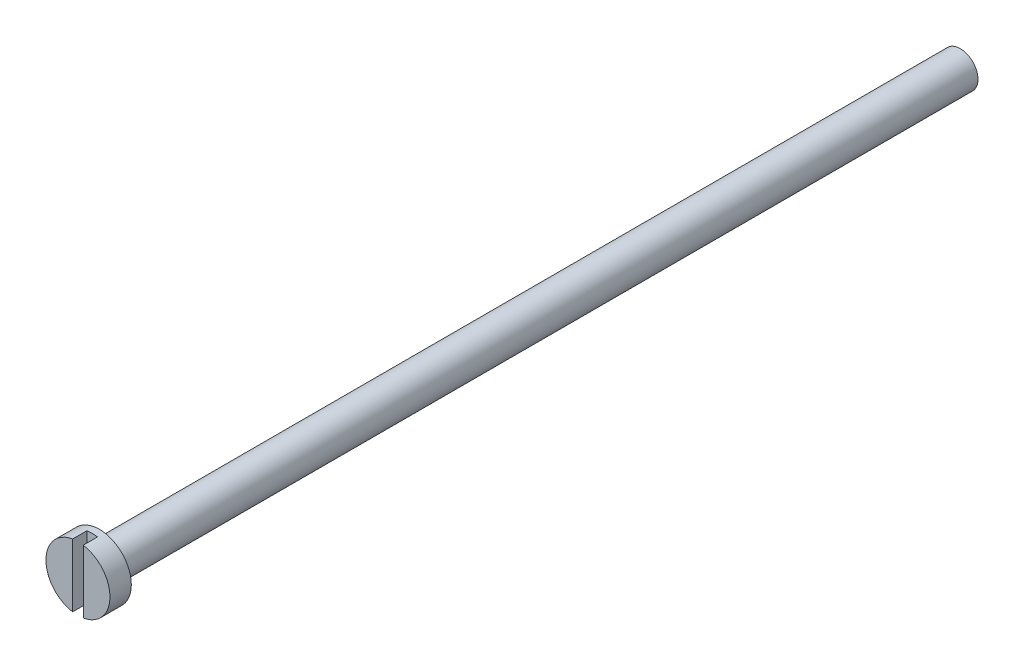
ISO-10303-21;
HEADER;
FILE_DESCRIPTION(('STEP AP214'),'2;1');
FILE_NAME('part.step','',(''),(''),'','','');
FILE_SCHEMA(('AUTOMOTIVE_DESIGN { 1 0 10303 214 1 1 1 1 }'));
ENDSEC;
DATA;
#1=APPLICATION_CONTEXT('core data for automotive mechanical design processes');
#2=APPLICATION_PROTOCOL_DEFINITION('international standard','automotive_design',2000,#1);
#3=PRODUCT_CONTEXT('',#1,'mechanical');
#4=PRODUCT('Part','Part','',(#3));
#5=PRODUCT_RELATED_PRODUCT_CATEGORY('part','',(#4));
#6=PRODUCT_DEFINITION_FORMATION('','',#4);
#7=PRODUCT_DEFINITION_CONTEXT('part definition',#1,'design');
#8=PRODUCT_DEFINITION('design','',#6,#7);
#9=PRODUCT_DEFINITION_SHAPE('','',#8);
#10=(LENGTH_UNIT() NAMED_UNIT(*) SI_UNIT(.MILLI.,.METRE.));
#11=(NAMED_UNIT(*) PLANE_ANGLE_UNIT() SI_UNIT($,.RADIAN.));
#12=(NAMED_UNIT(*) SI_UNIT($,.STERADIAN.) SOLID_ANGLE_UNIT());
#13=UNCERTAINTY_MEASURE_WITH_UNIT(LENGTH_MEASURE(1.E-05),#10,'distance_accuracy_value','');
#14=(GEOMETRIC_REPRESENTATION_CONTEXT(3) GLOBAL_UNCERTAINTY_ASSIGNED_CONTEXT((#13)) GLOBAL_UNIT_ASSIGNED_CONTEXT((#10,
#11,#12)) REPRESENTATION_CONTEXT('',''));
#15=CARTESIAN_POINT('',(0.,0.,0.));
#16=DIRECTION('',(0.,0.,1.));
#17=DIRECTION('',(1.,0.,0.));
#18=AXIS2_PLACEMENT_3D('',#15,#16,#17);
#19=CARTESIAN_POINT('',(0.,0.,124.));
#20=DIRECTION('',(0.,0.,1.));
#21=DIRECTION('',(1.,0.,0.));
#22=AXIS2_PLACEMENT_3D('',#19,#20,#21);
#23=PLANE('',#22);
#24=DIRECTION('',(0.,1.,0.));
#25=VECTOR('',#24,1.);
#26=CARTESIAN_POINT('',(0.75,0.,124.));
#27=LINE('',#26,#25);
#28=CARTESIAN_POINT('',(0.750000000000001,-4.43705983732471,124.));
#29=VERTEX_POINT('',#28);
#30=CARTESIAN_POINT('',(0.75,4.43705983732471,124.));
#31=VERTEX_POINT('',#30);
#32=EDGE_CURVE('E86',#29,#31,#27,.T.);
#33=ORIENTED_EDGE('',*,*,#32,.F.);
#34=CARTESIAN_POINT('',(0.,0.,124.));
#35=DIRECTION('',(0.,0.,1.));
#36=DIRECTION('',(1.,0.,0.));
#37=AXIS2_PLACEMENT_3D('',#34,#35,#36);
#38=CIRCLE('',#37,4.5);
#39=EDGE_CURVE('E100',#29,#31,#38,.T.);
#40=ORIENTED_EDGE('',*,*,#39,.T.);
#41=EDGE_LOOP('',(#33,#40));
#42=FACE_BOUND('',#41,.T.);
#43=ADVANCED_FACE('F39',(#42),#23,.T.);
#44=CARTESIAN_POINT('',(0.,0.,121.));
#45=DIRECTION('',(0.,0.,-1.));
#46=DIRECTION('',(-1.,0.,0.));
#47=AXIS2_PLACEMENT_3D('',#44,#45,#46);
#48=CYLINDRICAL_SURFACE('',#47,2.5);
#49=CARTESIAN_POINT('',(0.,0.,121.));
#50=DIRECTION('',(0.,0.,1.));
#51=DIRECTION('',(1.,0.,0.));
#52=AXIS2_PLACEMENT_3D('',#49,#50,#51);
#53=CIRCLE('',#52,2.5);
#54=CARTESIAN_POINT('',(2.5,0.,121.));
#55=VERTEX_POINT('',#54);
#56=EDGE_CURVE('E87',#55,#55,#53,.T.);
#57=ORIENTED_EDGE('',*,*,#56,.F.);
#58=EDGE_LOOP('',(#57));
#59=FACE_BOUND('',#58,.T.);
#60=CARTESIAN_POINT('',(0.,0.,0.));
#61=DIRECTION('',(0.,0.,1.));
#62=DIRECTION('',(1.,0.,0.));
#63=AXIS2_PLACEMENT_3D('',#60,#61,#62);
#64=CIRCLE('',#63,2.5);
#65=CARTESIAN_POINT('',(2.5,0.,0.));
#66=VERTEX_POINT('',#65);
#67=EDGE_CURVE('E99',#66,#66,#64,.T.);
#68=ORIENTED_EDGE('',*,*,#67,.T.);
#69=EDGE_LOOP('',(#68));
#70=FACE_BOUND('',#69,.T.);
#71=ADVANCED_FACE('F41',(#59,#70),#48,.T.);
#72=CARTESIAN_POINT('',(0.,0.,0.));
#73=DIRECTION('',(0.,0.,1.));
#74=DIRECTION('',(1.,0.,0.));
#75=AXIS2_PLACEMENT_3D('',#72,#73,#74);
#76=PLANE('',#75);
#77=ORIENTED_EDGE('',*,*,#67,.F.);
#78=EDGE_LOOP('',(#77));
#79=FACE_BOUND('',#78,.T.);
#80=ADVANCED_FACE('F128',(#79),#76,.F.);
#81=CARTESIAN_POINT('',(0.,0.,124.));
#82=DIRECTION('',(0.,0.,-1.));
#83=DIRECTION('',(-1.,0.,0.));
#84=AXIS2_PLACEMENT_3D('',#81,#82,#83);
#85=CYLINDRICAL_SURFACE('',#84,4.5);
#86=CARTESIAN_POINT('',(0.,0.,122.));
#87=DIRECTION('',(0.,0.,1.));
#88=DIRECTION('',(1.,0.,0.));
#89=AXIS2_PLACEMENT_3D('',#86,#87,#88);
#90=CIRCLE('',#89,4.5);
#91=CARTESIAN_POINT('',(0.75,4.43705983732471,122.));
#92=VERTEX_POINT('',#91);
#93=CARTESIAN_POINT('',(-0.75,4.43705983732471,122.));
#94=VERTEX_POINT('',#93);
#95=EDGE_CURVE('E11',#92,#94,#90,.T.);
#96=ORIENTED_EDGE('',*,*,#95,.F.);
#97=DIRECTION('',(0.,0.,-1.));
#98=VECTOR('',#97,1.);
#99=CARTESIAN_POINT('',(0.75,4.43705983732471,124.));
#100=LINE('',#99,#98);
#101=EDGE_CURVE('E62',#92,#31,#100,.F.);
#102=ORIENTED_EDGE('',*,*,#101,.T.);
#103=ORIENTED_EDGE('',*,*,#39,.F.);
#104=DIRECTION('',(0.,0.,-1.));
#105=VECTOR('',#104,1.);
#106=CARTESIAN_POINT('',(0.750000000000001,-4.43705983732471,124.));
#107=LINE('',#106,#105);
#108=CARTESIAN_POINT('',(0.750000000000001,-4.43705983732471,122.));
#109=VERTEX_POINT('',#108);
#110=EDGE_CURVE('E108',#29,#109,#107,.T.);
#111=ORIENTED_EDGE('',*,*,#110,.T.);
#112=CARTESIAN_POINT('',(-0.749999999999999,-4.43705983732471,122.));
#113=VERTEX_POINT('',#112);
#114=EDGE_CURVE('E43',#113,#109,#90,.T.);
#115=ORIENTED_EDGE('',*,*,#114,.F.);
#116=DIRECTION('',(0.,0.,-1.));
#117=VECTOR('',#116,1.);
#118=CARTESIAN_POINT('',(-0.749999999999999,-4.43705983732471,124.));
#119=LINE('',#118,#117);
#120=CARTESIAN_POINT('',(-0.749999999999999,-4.43705983732471,124.));
#121=VERTEX_POINT('',#120);
#122=EDGE_CURVE('E81',#113,#121,#119,.F.);
#123=ORIENTED_EDGE('',*,*,#122,.T.);
#124=CARTESIAN_POINT('',(-0.75,4.43705983732471,124.));
#125=VERTEX_POINT('',#124);
#126=EDGE_CURVE('E94',#125,#121,#38,.T.);
#127=ORIENTED_EDGE('',*,*,#126,.F.);
#128=DIRECTION('',(0.,0.,-1.));
#129=VECTOR('',#128,1.);
#130=CARTESIAN_POINT('',(-0.75,4.43705983732471,124.));
#131=LINE('',#130,#129);
#132=EDGE_CURVE('E54',#125,#94,#131,.T.);
#133=ORIENTED_EDGE('',*,*,#132,.T.);
#134=EDGE_LOOP('',(#96,#102,#103,#111,#115,#123,#127,#133));
#135=FACE_BOUND('',#134,.T.);
#136=CARTESIAN_POINT('',(0.,0.,121.));
#137=DIRECTION('',(0.,0.,1.));
#138=DIRECTION('',(1.,0.,0.));
#139=AXIS2_PLACEMENT_3D('',#136,#137,#138);
#140=CIRCLE('',#139,4.5);
#141=CARTESIAN_POINT('',(4.5,0.,121.));
#142=VERTEX_POINT('',#141);
#143=EDGE_CURVE('E105',#142,#142,#140,.T.);
#144=ORIENTED_EDGE('',*,*,#143,.T.);
#145=EDGE_LOOP('',(#144));
#146=FACE_BOUND('',#145,.T.);
#147=ADVANCED_FACE('F92',(#135,#146),#85,.T.);
#148=DIRECTION('',(0.,-1.,0.));
#149=VECTOR('',#148,1.);
#150=CARTESIAN_POINT('',(-0.75,0.,124.));
#151=LINE('',#150,#149);
#152=EDGE_CURVE('E78',#125,#121,#151,.T.);
#153=ORIENTED_EDGE('',*,*,#152,.F.);
#154=ORIENTED_EDGE('',*,*,#126,.T.);
#155=EDGE_LOOP('',(#153,#154));
#156=FACE_BOUND('',#155,.T.);
#157=ADVANCED_FACE('F98',(#156),#23,.T.);
#158=CARTESIAN_POINT('',(0.,0.,121.));
#159=DIRECTION('',(0.,0.,1.));
#160=DIRECTION('',(1.,0.,0.));
#161=AXIS2_PLACEMENT_3D('',#158,#159,#160);
#162=PLANE('',#161);
#163=ORIENTED_EDGE('',*,*,#56,.T.);
#164=EDGE_LOOP('',(#163));
#165=FACE_BOUND('',#164,.T.);
#166=ORIENTED_EDGE('',*,*,#143,.F.);
#167=EDGE_LOOP('',(#166));
#168=FACE_BOUND('',#167,.T.);
#169=ADVANCED_FACE('F133',(#165,#168),#162,.F.);
#170=CARTESIAN_POINT('',(0.,0.,122.));
#171=DIRECTION('',(0.,0.,1.));
#172=DIRECTION('',(1.,0.,0.));
#173=AXIS2_PLACEMENT_3D('',#170,#171,#172);
#174=PLANE('',#173);
#175=ORIENTED_EDGE('',*,*,#95,.T.);
#176=DIRECTION('',(0.,-1.,0.));
#177=VECTOR('',#176,1.);
#178=CARTESIAN_POINT('',(-0.75,5.46844597131234,122.));
#179=LINE('',#178,#177);
#180=EDGE_CURVE('E96',#94,#113,#179,.T.);
#181=ORIENTED_EDGE('',*,*,#180,.T.);
#182=ORIENTED_EDGE('',*,*,#114,.T.);
#183=DIRECTION('',(0.,1.,0.));
#184=VECTOR('',#183,1.);
#185=CARTESIAN_POINT('',(0.75,5.46844597131234,122.));
#186=LINE('',#185,#184);
#187=EDGE_CURVE('E116',#109,#92,#186,.T.);
#188=ORIENTED_EDGE('',*,*,#187,.T.);
#189=EDGE_LOOP('',(#175,#181,#182,#188));
#190=FACE_BOUND('',#189,.T.);
#191=ADVANCED_FACE('F115',(#190),#174,.T.);
#192=CARTESIAN_POINT('',(0.75,5.46844597131234,122.));
#193=DIRECTION('',(1.,0.,0.));
#194=DIRECTION('',(0.,1.,0.));
#195=AXIS2_PLACEMENT_3D('',#192,#193,#194);
#196=PLANE('',#195);
#197=ORIENTED_EDGE('',*,*,#32,.T.);
#198=ORIENTED_EDGE('',*,*,#101,.F.);
#199=ORIENTED_EDGE('',*,*,#187,.F.);
#200=ORIENTED_EDGE('',*,*,#110,.F.);
#201=EDGE_LOOP('',(#197,#198,#199,#200));
#202=FACE_BOUND('',#201,.T.);
#203=ADVANCED_FACE('F117',(#202),#196,.F.);
#204=CARTESIAN_POINT('',(-0.75,5.46844597131234,122.));
#205=DIRECTION('',(-1.,0.,0.));
#206=DIRECTION('',(0.,-1.,0.));
#207=AXIS2_PLACEMENT_3D('',#204,#205,#206);
#208=PLANE('',#207);
#209=ORIENTED_EDGE('',*,*,#152,.T.);
#210=ORIENTED_EDGE('',*,*,#122,.F.);
#211=ORIENTED_EDGE('',*,*,#180,.F.);
#212=ORIENTED_EDGE('',*,*,#132,.F.);
#213=EDGE_LOOP('',(#209,#210,#211,#212));
#214=FACE_BOUND('',#213,.T.);
#215=ADVANCED_FACE('F80',(#214),#208,.F.);
#216=CLOSED_SHELL('',(#43,#71,#80,#147,#157,#169,#191,#203,#215));
#217=MANIFOLD_SOLID_BREP('B2',#216);
#218=ADVANCED_BREP_SHAPE_REPRESENTATION('',(#18,#217),#14);
#219=SHAPE_DEFINITION_REPRESENTATION(#9,#218);
ENDSEC;
END-ISO-10303-21;
